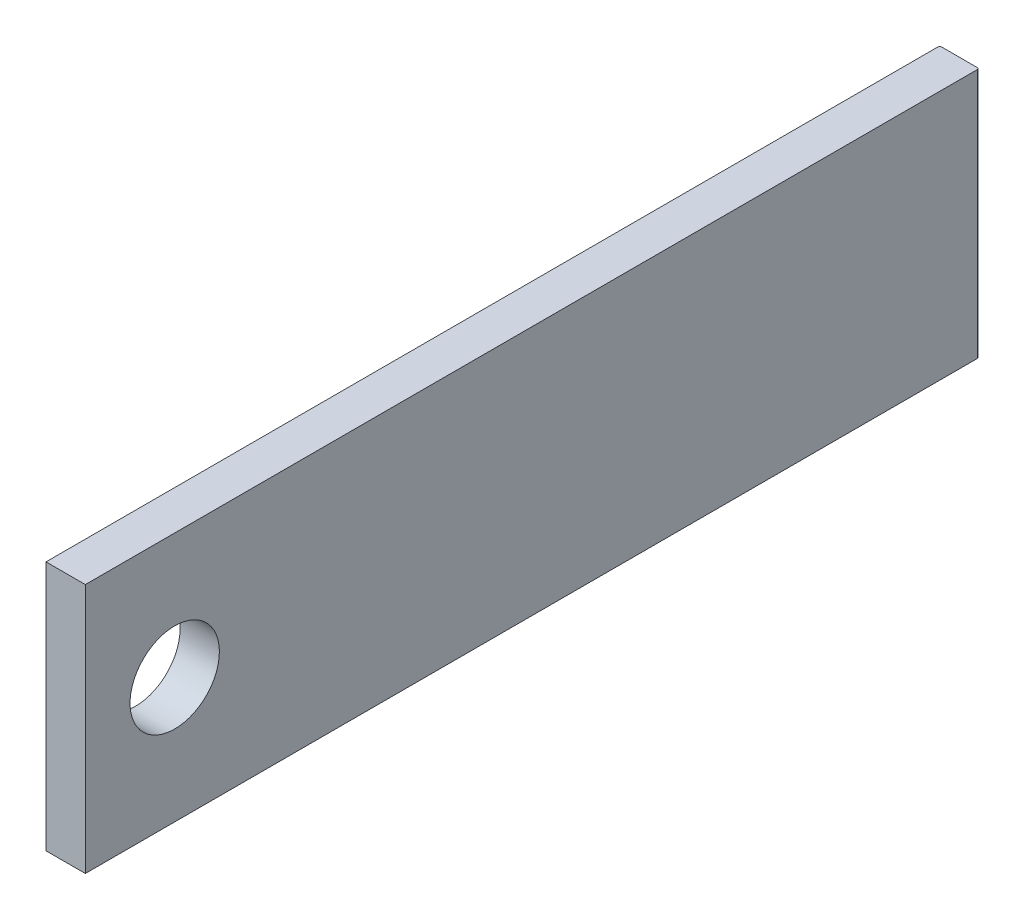
ISO-10303-21;
HEADER;
FILE_DESCRIPTION(('STEP AP214'),'2;1');
FILE_NAME('part.step','',(''),(''),'','','');
FILE_SCHEMA(('AUTOMOTIVE_DESIGN { 1 0 10303 214 1 1 1 1 }'));
ENDSEC;
DATA;
#1=APPLICATION_CONTEXT('core data for automotive mechanical design processes');
#2=APPLICATION_PROTOCOL_DEFINITION('international standard','automotive_design',2000,#1);
#3=PRODUCT_CONTEXT('',#1,'mechanical');
#4=PRODUCT('Part','Part','',(#3));
#5=PRODUCT_RELATED_PRODUCT_CATEGORY('part','',(#4));
#6=PRODUCT_DEFINITION_FORMATION('','',#4);
#7=PRODUCT_DEFINITION_CONTEXT('part definition',#1,'design');
#8=PRODUCT_DEFINITION('design','',#6,#7);
#9=PRODUCT_DEFINITION_SHAPE('','',#8);
#10=(LENGTH_UNIT() NAMED_UNIT(*) SI_UNIT(.MILLI.,.METRE.));
#11=(NAMED_UNIT(*) PLANE_ANGLE_UNIT() SI_UNIT($,.RADIAN.));
#12=(NAMED_UNIT(*) SI_UNIT($,.STERADIAN.) SOLID_ANGLE_UNIT());
#13=UNCERTAINTY_MEASURE_WITH_UNIT(LENGTH_MEASURE(1.E-05),#10,'distance_accuracy_value','');
#14=(GEOMETRIC_REPRESENTATION_CONTEXT(3) GLOBAL_UNCERTAINTY_ASSIGNED_CONTEXT((#13)) GLOBAL_UNIT_ASSIGNED_CONTEXT((#10,
#11,#12)) REPRESENTATION_CONTEXT('',''));
#15=CARTESIAN_POINT('',(0.,0.,0.));
#16=DIRECTION('',(0.,0.,1.));
#17=DIRECTION('',(1.,0.,0.));
#18=AXIS2_PLACEMENT_3D('',#15,#16,#17);
#19=CARTESIAN_POINT('',(2.2,7.,-25.));
#20=DIRECTION('',(0.,0.,1.));
#21=DIRECTION('',(1.,0.,0.));
#22=AXIS2_PLACEMENT_3D('',#19,#20,#21);
#23=PLANE('',#22);
#24=DIRECTION('',(-1.,0.,0.));
#25=VECTOR('',#24,1.);
#26=CARTESIAN_POINT('',(2.2,-7.,-25.));
#27=LINE('',#26,#25);
#28=CARTESIAN_POINT('',(2.1,-7.,-25.));
#29=VERTEX_POINT('',#28);
#30=CARTESIAN_POINT('',(0.0999999999999998,-7.,-25.));
#31=VERTEX_POINT('',#30);
#32=EDGE_CURVE('E127',#29,#31,#27,.T.);
#33=ORIENTED_EDGE('',*,*,#32,.T.);
#34=DIRECTION('',(0.,1.,0.));
#35=VECTOR('',#34,1.);
#36=CARTESIAN_POINT('',(0.0999999999999998,7.,-25.));
#37=LINE('',#36,#35);
#38=CARTESIAN_POINT('',(0.0999999999999998,7.,-25.));
#39=VERTEX_POINT('',#38);
#40=EDGE_CURVE('E157',#31,#39,#37,.T.);
#41=ORIENTED_EDGE('',*,*,#40,.T.);
#42=DIRECTION('',(-1.,0.,0.));
#43=VECTOR('',#42,1.);
#44=CARTESIAN_POINT('',(2.2,7.,-25.));
#45=LINE('',#44,#43);
#46=CARTESIAN_POINT('',(2.1,7.,-25.));
#47=VERTEX_POINT('',#46);
#48=EDGE_CURVE('E117',#47,#39,#45,.T.);
#49=ORIENTED_EDGE('',*,*,#48,.F.);
#50=DIRECTION('',(0.,1.,0.));
#51=VECTOR('',#50,1.);
#52=CARTESIAN_POINT('',(2.1,-7.,-25.));
#53=LINE('',#52,#51);
#54=EDGE_CURVE('E151',#47,#29,#53,.F.);
#55=ORIENTED_EDGE('',*,*,#54,.T.);
#56=EDGE_LOOP('',(#33,#41,#49,#55));
#57=FACE_BOUND('',#56,.T.);
#58=ADVANCED_FACE('F45',(#57),#23,.F.);
#59=CARTESIAN_POINT('',(2.2,7.,25.));
#60=DIRECTION('',(0.,-1.,0.));
#61=DIRECTION('',(0.,0.,-1.));
#62=AXIS2_PLACEMENT_3D('',#59,#60,#61);
#63=PLANE('',#62);
#64=ORIENTED_EDGE('',*,*,#48,.T.);
#65=CARTESIAN_POINT('',(0.0999999999999998,7.,-24.9));
#66=DIRECTION('',(0.,-1.,0.));
#67=DIRECTION('',(0.,0.,-1.));
#68=AXIS2_PLACEMENT_3D('',#65,#66,#67);
#69=CIRCLE('',#68,0.1);
#70=CARTESIAN_POINT('',(0.,7.,-24.9));
#71=VERTEX_POINT('',#70);
#72=EDGE_CURVE('E68',#39,#71,#69,.F.);
#73=ORIENTED_EDGE('',*,*,#72,.T.);
#74=DIRECTION('',(0.,0.,1.));
#75=VECTOR('',#74,1.);
#76=CARTESIAN_POINT('',(0.,7.,25.));
#77=LINE('',#76,#75);
#78=CARTESIAN_POINT('',(0.,7.,25.));
#79=VERTEX_POINT('',#78);
#80=EDGE_CURVE('E113',#71,#79,#77,.T.);
#81=ORIENTED_EDGE('',*,*,#80,.T.);
#82=DIRECTION('',(-1.,0.,0.));
#83=VECTOR('',#82,1.);
#84=CARTESIAN_POINT('',(2.2,7.,25.));
#85=LINE('',#84,#83);
#86=CARTESIAN_POINT('',(2.2,7.,25.));
#87=VERTEX_POINT('',#86);
#88=EDGE_CURVE('E111',#87,#79,#85,.T.);
#89=ORIENTED_EDGE('',*,*,#88,.F.);
#90=DIRECTION('',(0.,0.,1.));
#91=VECTOR('',#90,1.);
#92=CARTESIAN_POINT('',(2.2,7.,25.));
#93=LINE('',#92,#91);
#94=CARTESIAN_POINT('',(2.2,7.,-24.9));
#95=VERTEX_POINT('',#94);
#96=EDGE_CURVE('E98',#95,#87,#93,.T.);
#97=ORIENTED_EDGE('',*,*,#96,.F.);
#98=CARTESIAN_POINT('',(2.1,7.,-24.9));
#99=DIRECTION('',(0.,-1.,0.));
#100=DIRECTION('',(0.,0.,-1.));
#101=AXIS2_PLACEMENT_3D('',#98,#99,#100);
#102=CIRCLE('',#101,0.1);
#103=EDGE_CURVE('E148',#95,#47,#102,.F.);
#104=ORIENTED_EDGE('',*,*,#103,.T.);
#105=EDGE_LOOP('',(#64,#73,#81,#89,#97,#104));
#106=FACE_BOUND('',#105,.T.);
#107=ADVANCED_FACE('F112',(#106),#63,.F.);
#108=CARTESIAN_POINT('',(2.2,7.,25.));
#109=DIRECTION('',(0.,0.,-1.));
#110=DIRECTION('',(-1.,0.,0.));
#111=AXIS2_PLACEMENT_3D('',#108,#109,#110);
#112=PLANE('',#111);
#113=DIRECTION('',(0.,-1.,0.));
#114=VECTOR('',#113,1.);
#115=CARTESIAN_POINT('',(0.,7.,25.));
#116=LINE('',#115,#114);
#117=CARTESIAN_POINT('',(0.,-7.,25.));
#118=VERTEX_POINT('',#117);
#119=EDGE_CURVE('E133',#79,#118,#116,.T.);
#120=ORIENTED_EDGE('',*,*,#119,.T.);
#121=DIRECTION('',(-1.,0.,0.));
#122=VECTOR('',#121,1.);
#123=CARTESIAN_POINT('',(2.2,-7.,25.));
#124=LINE('',#123,#122);
#125=CARTESIAN_POINT('',(2.2,-7.,25.));
#126=VERTEX_POINT('',#125);
#127=EDGE_CURVE('E118',#126,#118,#124,.T.);
#128=ORIENTED_EDGE('',*,*,#127,.F.);
#129=DIRECTION('',(0.,-1.,0.));
#130=VECTOR('',#129,1.);
#131=CARTESIAN_POINT('',(2.2,7.,25.));
#132=LINE('',#131,#130);
#133=EDGE_CURVE('E103',#87,#126,#132,.T.);
#134=ORIENTED_EDGE('',*,*,#133,.F.);
#135=ORIENTED_EDGE('',*,*,#88,.T.);
#136=EDGE_LOOP('',(#120,#128,#134,#135));
#137=FACE_BOUND('',#136,.T.);
#138=ADVANCED_FACE('F120',(#137),#112,.F.);
#139=CARTESIAN_POINT('',(2.2,-7.,25.));
#140=DIRECTION('',(0.,1.,0.));
#141=DIRECTION('',(0.,0.,1.));
#142=AXIS2_PLACEMENT_3D('',#139,#140,#141);
#143=PLANE('',#142);
#144=DIRECTION('',(0.,0.,-1.));
#145=VECTOR('',#144,1.);
#146=CARTESIAN_POINT('',(0.,-7.,25.));
#147=LINE('',#146,#145);
#148=CARTESIAN_POINT('',(0.,-7.,-24.9));
#149=VERTEX_POINT('',#148);
#150=EDGE_CURVE('E108',#118,#149,#147,.T.);
#151=ORIENTED_EDGE('',*,*,#150,.T.);
#152=CARTESIAN_POINT('',(0.0999999999999998,-7.,-24.9));
#153=DIRECTION('',(0.,1.,0.));
#154=DIRECTION('',(0.,0.,1.));
#155=AXIS2_PLACEMENT_3D('',#152,#153,#154);
#156=CIRCLE('',#155,0.1);
#157=EDGE_CURVE('E11',#149,#31,#156,.F.);
#158=ORIENTED_EDGE('',*,*,#157,.T.);
#159=ORIENTED_EDGE('',*,*,#32,.F.);
#160=CARTESIAN_POINT('',(2.1,-7.,-24.9));
#161=DIRECTION('',(0.,1.,0.));
#162=DIRECTION('',(0.,0.,1.));
#163=AXIS2_PLACEMENT_3D('',#160,#161,#162);
#164=CIRCLE('',#163,0.1);
#165=CARTESIAN_POINT('',(2.2,-7.,-24.9));
#166=VERTEX_POINT('',#165);
#167=EDGE_CURVE('E154',#29,#166,#164,.F.);
#168=ORIENTED_EDGE('',*,*,#167,.T.);
#169=DIRECTION('',(0.,0.,-1.));
#170=VECTOR('',#169,1.);
#171=CARTESIAN_POINT('',(2.2,-7.,25.));
#172=LINE('',#171,#170);
#173=EDGE_CURVE('E124',#126,#166,#172,.T.);
#174=ORIENTED_EDGE('',*,*,#173,.F.);
#175=ORIENTED_EDGE('',*,*,#127,.T.);
#176=EDGE_LOOP('',(#151,#158,#159,#168,#174,#175));
#177=FACE_BOUND('',#176,.T.);
#178=ADVANCED_FACE('F174',(#177),#143,.F.);
#179=CARTESIAN_POINT('',(2.2,0.,0.));
#180=DIRECTION('',(1.,0.,0.));
#181=DIRECTION('',(0.,0.,-1.));
#182=AXIS2_PLACEMENT_3D('',#179,#180,#181);
#183=PLANE('',#182);
#184=CARTESIAN_POINT('',(2.2,0.,20.));
#185=DIRECTION('',(1.,0.,0.));
#186=DIRECTION('',(0.,0.,-1.));
#187=AXIS2_PLACEMENT_3D('',#184,#185,#186);
#188=CIRCLE('',#187,2.5);
#189=CARTESIAN_POINT('',(2.2,0.,17.5));
#190=VERTEX_POINT('',#189);
#191=EDGE_CURVE('E207',#190,#190,#188,.T.);
#192=ORIENTED_EDGE('',*,*,#191,.F.);
#193=EDGE_LOOP('',(#192));
#194=FACE_BOUND('',#193,.T.);
#195=ORIENTED_EDGE('',*,*,#173,.T.);
#196=DIRECTION('',(0.,1.,0.));
#197=VECTOR('',#196,1.);
#198=CARTESIAN_POINT('',(2.2,7.,-24.9));
#199=LINE('',#198,#197);
#200=EDGE_CURVE('E106',#166,#95,#199,.T.);
#201=ORIENTED_EDGE('',*,*,#200,.T.);
#202=ORIENTED_EDGE('',*,*,#96,.T.);
#203=ORIENTED_EDGE('',*,*,#133,.T.);
#204=EDGE_LOOP('',(#195,#201,#202,#203));
#205=FACE_BOUND('',#204,.T.);
#206=ADVANCED_FACE('F101',(#194,#205),#183,.T.);
#207=CARTESIAN_POINT('',(0.,0.,0.));
#208=DIRECTION('',(1.,0.,0.));
#209=DIRECTION('',(0.,0.,-1.));
#210=AXIS2_PLACEMENT_3D('',#207,#208,#209);
#211=PLANE('',#210);
#212=CARTESIAN_POINT('',(0.,0.,20.));
#213=DIRECTION('',(1.,0.,0.));
#214=DIRECTION('',(0.,0.,-1.));
#215=AXIS2_PLACEMENT_3D('',#212,#213,#214);
#216=CIRCLE('',#215,2.5);
#217=CARTESIAN_POINT('',(0.,0.,17.5));
#218=VERTEX_POINT('',#217);
#219=EDGE_CURVE('E134',#218,#218,#216,.T.);
#220=ORIENTED_EDGE('',*,*,#219,.T.);
#221=EDGE_LOOP('',(#220));
#222=FACE_BOUND('',#221,.T.);
#223=ORIENTED_EDGE('',*,*,#80,.F.);
#224=DIRECTION('',(0.,1.,0.));
#225=VECTOR('',#224,1.);
#226=CARTESIAN_POINT('',(0.,0.,-24.9));
#227=LINE('',#226,#225);
#228=EDGE_CURVE('E54',#71,#149,#227,.F.);
#229=ORIENTED_EDGE('',*,*,#228,.T.);
#230=ORIENTED_EDGE('',*,*,#150,.F.);
#231=ORIENTED_EDGE('',*,*,#119,.F.);
#232=EDGE_LOOP('',(#223,#229,#230,#231));
#233=FACE_BOUND('',#232,.T.);
#234=ADVANCED_FACE('F192',(#222,#233),#211,.F.);
#235=CARTESIAN_POINT('',(0.,0.,20.));
#236=DIRECTION('',(1.,0.,0.));
#237=DIRECTION('',(0.,0.,-1.));
#238=AXIS2_PLACEMENT_3D('',#235,#236,#237);
#239=CYLINDRICAL_SURFACE('',#238,2.5);
#240=ORIENTED_EDGE('',*,*,#219,.F.);
#241=EDGE_LOOP('',(#240));
#242=FACE_BOUND('',#241,.T.);
#243=ORIENTED_EDGE('',*,*,#191,.T.);
#244=EDGE_LOOP('',(#243));
#245=FACE_BOUND('',#244,.T.);
#246=ADVANCED_FACE('F180',(#242,#245),#239,.F.);
#247=CARTESIAN_POINT('',(2.1,0.,-24.9));
#248=DIRECTION('',(0.,-1.,0.));
#249=DIRECTION('',(0.,0.,-1.));
#250=AXIS2_PLACEMENT_3D('',#247,#248,#249);
#251=CYLINDRICAL_SURFACE('',#250,0.1);
#252=ORIENTED_EDGE('',*,*,#167,.F.);
#253=ORIENTED_EDGE('',*,*,#54,.F.);
#254=ORIENTED_EDGE('',*,*,#103,.F.);
#255=ORIENTED_EDGE('',*,*,#200,.F.);
#256=EDGE_LOOP('',(#252,#253,#254,#255));
#257=FACE_BOUND('',#256,.T.);
#258=ADVANCED_FACE('F172',(#257),#251,.T.);
#259=CARTESIAN_POINT('',(0.0999999999999998,7.,-24.9));
#260=DIRECTION('',(0.,1.,0.));
#261=DIRECTION('',(0.,0.,1.));
#262=AXIS2_PLACEMENT_3D('',#259,#260,#261);
#263=CYLINDRICAL_SURFACE('',#262,0.1);
#264=ORIENTED_EDGE('',*,*,#157,.F.);
#265=ORIENTED_EDGE('',*,*,#228,.F.);
#266=ORIENTED_EDGE('',*,*,#72,.F.);
#267=ORIENTED_EDGE('',*,*,#40,.F.);
#268=EDGE_LOOP('',(#264,#265,#266,#267));
#269=FACE_BOUND('',#268,.T.);
#270=ADVANCED_FACE('F47',(#269),#263,.T.);
#271=CLOSED_SHELL('',(#58,#107,#138,#178,#206,#234,#246,#258,#270));
#272=MANIFOLD_SOLID_BREP('B2',#271);
#273=ADVANCED_BREP_SHAPE_REPRESENTATION('',(#18,#272),#14);
#274=SHAPE_DEFINITION_REPRESENTATION(#9,#273);
ENDSEC;
END-ISO-10303-21;
